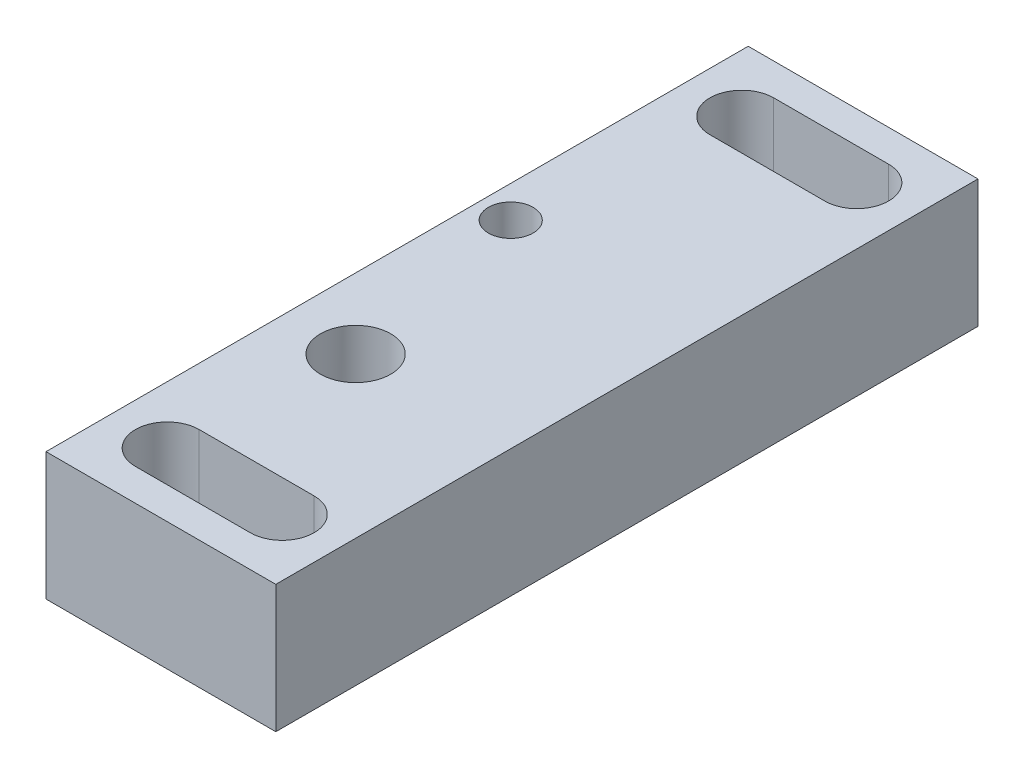
ISO-10303-21;
HEADER;
FILE_DESCRIPTION(('STEP AP214'),'2;1');
FILE_NAME('part.step','',(''),(''),'','','');
FILE_SCHEMA(('AUTOMOTIVE_DESIGN { 1 0 10303 214 1 1 1 1 }'));
ENDSEC;
DATA;
#1=APPLICATION_CONTEXT('core data for automotive mechanical design processes');
#2=APPLICATION_PROTOCOL_DEFINITION('international standard','automotive_design',2000,#1);
#3=PRODUCT_CONTEXT('',#1,'mechanical');
#4=PRODUCT('Part','Part','',(#3));
#5=PRODUCT_RELATED_PRODUCT_CATEGORY('part','',(#4));
#6=PRODUCT_DEFINITION_FORMATION('','',#4);
#7=PRODUCT_DEFINITION_CONTEXT('part definition',#1,'design');
#8=PRODUCT_DEFINITION('design','',#6,#7);
#9=PRODUCT_DEFINITION_SHAPE('','',#8);
#10=(LENGTH_UNIT() NAMED_UNIT(*) SI_UNIT(.MILLI.,.METRE.));
#11=(NAMED_UNIT(*) PLANE_ANGLE_UNIT() SI_UNIT($,.RADIAN.));
#12=(NAMED_UNIT(*) SI_UNIT($,.STERADIAN.) SOLID_ANGLE_UNIT());
#13=UNCERTAINTY_MEASURE_WITH_UNIT(LENGTH_MEASURE(1.E-05),#10,'distance_accuracy_value','');
#14=(GEOMETRIC_REPRESENTATION_CONTEXT(3) GLOBAL_UNCERTAINTY_ASSIGNED_CONTEXT((#13)) GLOBAL_UNIT_ASSIGNED_CONTEXT((#10,
#11,#12)) REPRESENTATION_CONTEXT('',''));
#15=CARTESIAN_POINT('',(0.,0.,0.));
#16=DIRECTION('',(0.,0.,1.));
#17=DIRECTION('',(1.,0.,0.));
#18=AXIS2_PLACEMENT_3D('',#15,#16,#17);
#19=CARTESIAN_POINT('',(0.,10.,0.));
#20=DIRECTION('',(0.,1.,0.));
#21=DIRECTION('',(0.,0.,1.));
#22=AXIS2_PLACEMENT_3D('',#19,#20,#21);
#23=PLANE('',#22);
#24=CARTESIAN_POINT('',(4.5,10.,22.5));
#25=DIRECTION('',(0.,-1.,0.));
#26=DIRECTION('',(0.,0.,1.));
#27=AXIS2_PLACEMENT_3D('',#24,#25,#26);
#28=CIRCLE('',#27,2.5);
#29=CARTESIAN_POINT('',(4.5,10.,25.));
#30=VERTEX_POINT('',#29);
#31=CARTESIAN_POINT('',(4.5,10.,20.));
#32=VERTEX_POINT('',#31);
#33=EDGE_CURVE('E187',#30,#32,#28,.F.);
#34=ORIENTED_EDGE('',*,*,#33,.F.);
#35=DIRECTION('',(-1.,0.,0.));
#36=VECTOR('',#35,1.);
#37=CARTESIAN_POINT('',(0.,10.,25.));
#38=LINE('',#37,#36);
#39=CARTESIAN_POINT('',(-4.5,10.,25.));
#40=VERTEX_POINT('',#39);
#41=EDGE_CURVE('E190',#30,#40,#38,.T.);
#42=ORIENTED_EDGE('',*,*,#41,.T.);
#43=CARTESIAN_POINT('',(-4.5,10.,22.5));
#44=DIRECTION('',(0.,-1.,0.));
#45=DIRECTION('',(0.,0.,1.));
#46=AXIS2_PLACEMENT_3D('',#43,#44,#45);
#47=CIRCLE('',#46,2.5);
#48=CARTESIAN_POINT('',(-4.5,10.,20.));
#49=VERTEX_POINT('',#48);
#50=EDGE_CURVE('E194',#49,#40,#47,.F.);
#51=ORIENTED_EDGE('',*,*,#50,.F.);
#52=DIRECTION('',(1.,0.,0.));
#53=VECTOR('',#52,1.);
#54=CARTESIAN_POINT('',(0.,10.,20.));
#55=LINE('',#54,#53);
#56=EDGE_CURVE('E196',#49,#32,#55,.T.);
#57=ORIENTED_EDGE('',*,*,#56,.T.);
#58=EDGE_LOOP('',(#34,#42,#51,#57));
#59=FACE_BOUND('',#58,.T.);
#60=CARTESIAN_POINT('',(-3.5,10.,8.75000000000001));
#61=DIRECTION('',(0.,-1.,0.));
#62=DIRECTION('',(0.,0.,1.));
#63=AXIS2_PLACEMENT_3D('',#60,#61,#62);
#64=CIRCLE('',#63,2.75);
#65=CARTESIAN_POINT('',(-3.5,10.,11.5));
#66=VERTEX_POINT('',#65);
#67=EDGE_CURVE('E251',#66,#66,#64,.T.);
#68=ORIENTED_EDGE('',*,*,#67,.T.);
#69=EDGE_LOOP('',(#68));
#70=FACE_BOUND('',#69,.T.);
#71=CARTESIAN_POINT('',(-6.5,10.,-6.4));
#72=DIRECTION('',(0.,-1.,0.));
#73=DIRECTION('',(0.,0.,1.));
#74=AXIS2_PLACEMENT_3D('',#71,#72,#73);
#75=CIRCLE('',#74,1.75);
#76=CARTESIAN_POINT('',(-6.5,10.,-4.65));
#77=VERTEX_POINT('',#76);
#78=EDGE_CURVE('E255',#77,#77,#75,.T.);
#79=ORIENTED_EDGE('',*,*,#78,.T.);
#80=EDGE_LOOP('',(#79));
#81=FACE_BOUND('',#80,.T.);
#82=DIRECTION('',(0.,0.,-1.));
#83=VECTOR('',#82,1.);
#84=CARTESIAN_POINT('',(-9.,10.,-27.5));
#85=LINE('',#84,#83);
#86=CARTESIAN_POINT('',(-9.,10.,27.5));
#87=VERTEX_POINT('',#86);
#88=CARTESIAN_POINT('',(-9.,10.,-27.5));
#89=VERTEX_POINT('',#88);
#90=EDGE_CURVE('E258',#87,#89,#85,.T.);
#91=ORIENTED_EDGE('',*,*,#90,.F.);
#92=DIRECTION('',(-1.,0.,0.));
#93=VECTOR('',#92,1.);
#94=CARTESIAN_POINT('',(8.99999999999999,10.,27.5));
#95=LINE('',#94,#93);
#96=CARTESIAN_POINT('',(8.99999999999999,10.,27.5));
#97=VERTEX_POINT('',#96);
#98=EDGE_CURVE('E268',#97,#87,#95,.T.);
#99=ORIENTED_EDGE('',*,*,#98,.F.);
#100=DIRECTION('',(0.,0.,1.));
#101=VECTOR('',#100,1.);
#102=CARTESIAN_POINT('',(9.,10.,-27.5));
#103=LINE('',#102,#101);
#104=CARTESIAN_POINT('',(9.,10.,-27.5));
#105=VERTEX_POINT('',#104);
#106=EDGE_CURVE('E265',#105,#97,#103,.T.);
#107=ORIENTED_EDGE('',*,*,#106,.F.);
#108=DIRECTION('',(1.,0.,0.));
#109=VECTOR('',#108,1.);
#110=CARTESIAN_POINT('',(9.,10.,-27.5));
#111=LINE('',#110,#109);
#112=EDGE_CURVE('E261',#89,#105,#111,.T.);
#113=ORIENTED_EDGE('',*,*,#112,.F.);
#114=EDGE_LOOP('',(#91,#99,#107,#113));
#115=FACE_BOUND('',#114,.T.);
#116=DIRECTION('',(1.,0.,0.));
#117=VECTOR('',#116,1.);
#118=CARTESIAN_POINT('',(0.,10.,-20.));
#119=LINE('',#118,#117);
#120=CARTESIAN_POINT('',(-4.5,10.,-20.));
#121=VERTEX_POINT('',#120);
#122=CARTESIAN_POINT('',(4.5,10.,-20.));
#123=VERTEX_POINT('',#122);
#124=EDGE_CURVE('E165',#121,#123,#119,.T.);
#125=ORIENTED_EDGE('',*,*,#124,.F.);
#126=CARTESIAN_POINT('',(-4.5,10.,-22.5));
#127=DIRECTION('',(0.,-1.,0.));
#128=DIRECTION('',(0.,0.,1.));
#129=AXIS2_PLACEMENT_3D('',#126,#127,#128);
#130=CIRCLE('',#129,2.5);
#131=CARTESIAN_POINT('',(-4.5,10.,-25.));
#132=VERTEX_POINT('',#131);
#133=EDGE_CURVE('E170',#121,#132,#130,.T.);
#134=ORIENTED_EDGE('',*,*,#133,.T.);
#135=DIRECTION('',(-1.,0.,0.));
#136=VECTOR('',#135,1.);
#137=CARTESIAN_POINT('',(0.,10.,-25.));
#138=LINE('',#137,#136);
#139=CARTESIAN_POINT('',(4.5,10.,-25.));
#140=VERTEX_POINT('',#139);
#141=EDGE_CURVE('E166',#140,#132,#138,.T.);
#142=ORIENTED_EDGE('',*,*,#141,.F.);
#143=CARTESIAN_POINT('',(4.5,10.,-22.5));
#144=DIRECTION('',(0.,-1.,0.));
#145=DIRECTION('',(0.,0.,1.));
#146=AXIS2_PLACEMENT_3D('',#143,#144,#145);
#147=CIRCLE('',#146,2.5);
#148=EDGE_CURVE('E151',#140,#123,#147,.T.);
#149=ORIENTED_EDGE('',*,*,#148,.T.);
#150=EDGE_LOOP('',(#125,#134,#142,#149));
#151=FACE_BOUND('',#150,.T.);
#152=ADVANCED_FACE('F33',(#59,#70,#81,#115,#151),#23,.T.);
#153=CARTESIAN_POINT('',(0.,0.,0.));
#154=DIRECTION('',(0.,1.,0.));
#155=DIRECTION('',(0.,0.,1.));
#156=AXIS2_PLACEMENT_3D('',#153,#154,#155);
#157=PLANE('',#156);
#158=CARTESIAN_POINT('',(-6.5,0.,-6.4));
#159=DIRECTION('',(0.,1.,0.));
#160=DIRECTION('',(0.,0.,-1.));
#161=AXIS2_PLACEMENT_3D('',#158,#159,#160);
#162=CIRCLE('',#161,3.);
#163=CARTESIAN_POINT('',(-6.5,0.,-3.4));
#164=VERTEX_POINT('',#163);
#165=CARTESIAN_POINT('',(-6.5,0.,-9.4));
#166=VERTEX_POINT('',#165);
#167=EDGE_CURVE('E159',#164,#166,#162,.T.);
#168=ORIENTED_EDGE('',*,*,#167,.T.);
#169=DIRECTION('',(-1.,0.,0.));
#170=VECTOR('',#169,1.);
#171=CARTESIAN_POINT('',(0.,0.,-9.39999999999999));
#172=LINE('',#171,#170);
#173=CARTESIAN_POINT('',(-9.,0.,-9.4));
#174=VERTEX_POINT('',#173);
#175=EDGE_CURVE('E233',#166,#174,#172,.T.);
#176=ORIENTED_EDGE('',*,*,#175,.T.);
#177=DIRECTION('',(0.,0.,-1.));
#178=VECTOR('',#177,1.);
#179=CARTESIAN_POINT('',(-9.,0.,-27.5));
#180=LINE('',#179,#178);
#181=CARTESIAN_POINT('',(-9.,0.,-27.5));
#182=VERTEX_POINT('',#181);
#183=EDGE_CURVE('E254',#174,#182,#180,.T.);
#184=ORIENTED_EDGE('',*,*,#183,.T.);
#185=DIRECTION('',(1.,0.,0.));
#186=VECTOR('',#185,1.);
#187=CARTESIAN_POINT('',(9.,0.,-27.5));
#188=LINE('',#187,#186);
#189=CARTESIAN_POINT('',(9.,0.,-27.5));
#190=VERTEX_POINT('',#189);
#191=EDGE_CURVE('E275',#182,#190,#188,.T.);
#192=ORIENTED_EDGE('',*,*,#191,.T.);
#193=DIRECTION('',(0.,0.,1.));
#194=VECTOR('',#193,1.);
#195=CARTESIAN_POINT('',(9.,0.,-27.5));
#196=LINE('',#195,#194);
#197=CARTESIAN_POINT('',(8.99999999999999,0.,27.5));
#198=VERTEX_POINT('',#197);
#199=EDGE_CURVE('E278',#190,#198,#196,.T.);
#200=ORIENTED_EDGE('',*,*,#199,.T.);
#201=DIRECTION('',(-1.,0.,0.));
#202=VECTOR('',#201,1.);
#203=CARTESIAN_POINT('',(8.99999999999999,0.,27.5));
#204=LINE('',#203,#202);
#205=CARTESIAN_POINT('',(-9.,0.,27.5));
#206=VERTEX_POINT('',#205);
#207=EDGE_CURVE('E262',#198,#206,#204,.T.);
#208=ORIENTED_EDGE('',*,*,#207,.T.);
#209=CARTESIAN_POINT('',(-9.,0.,-3.4));
#210=VERTEX_POINT('',#209);
#211=EDGE_CURVE('E272',#206,#210,#180,.T.);
#212=ORIENTED_EDGE('',*,*,#211,.T.);
#213=DIRECTION('',(1.,0.,0.));
#214=VECTOR('',#213,1.);
#215=CARTESIAN_POINT('',(0.,0.,-3.4));
#216=LINE('',#215,#214);
#217=EDGE_CURVE('E220',#210,#164,#216,.T.);
#218=ORIENTED_EDGE('',*,*,#217,.T.);
#219=EDGE_LOOP('',(#168,#176,#184,#192,#200,#208,#212,#218));
#220=FACE_BOUND('',#219,.T.);
#221=CARTESIAN_POINT('',(-3.5,0.,8.75000000000001));
#222=DIRECTION('',(0.,1.,0.));
#223=DIRECTION('',(0.,0.,-1.));
#224=AXIS2_PLACEMENT_3D('',#221,#222,#223);
#225=CIRCLE('',#224,4.75);
#226=CARTESIAN_POINT('',(-3.5,0.,4.00000000000001));
#227=VERTEX_POINT('',#226);
#228=EDGE_CURVE('E240',#227,#227,#225,.T.);
#229=ORIENTED_EDGE('',*,*,#228,.T.);
#230=EDGE_LOOP('',(#229));
#231=FACE_BOUND('',#230,.T.);
#232=DIRECTION('',(1.,0.,0.));
#233=VECTOR('',#232,1.);
#234=CARTESIAN_POINT('',(0.,0.,20.));
#235=LINE('',#234,#233);
#236=CARTESIAN_POINT('',(-4.5,0.,20.));
#237=VERTEX_POINT('',#236);
#238=CARTESIAN_POINT('',(4.5,0.,20.));
#239=VERTEX_POINT('',#238);
#240=EDGE_CURVE('E191',#237,#239,#235,.T.);
#241=ORIENTED_EDGE('',*,*,#240,.F.);
#242=CARTESIAN_POINT('',(-4.5,0.,22.5));
#243=DIRECTION('',(0.,-1.,0.));
#244=DIRECTION('',(0.,0.,1.));
#245=AXIS2_PLACEMENT_3D('',#242,#243,#244);
#246=CIRCLE('',#245,2.5);
#247=CARTESIAN_POINT('',(-4.5,0.,25.));
#248=VERTEX_POINT('',#247);
#249=EDGE_CURVE('E206',#237,#248,#246,.F.);
#250=ORIENTED_EDGE('',*,*,#249,.T.);
#251=DIRECTION('',(-1.,0.,0.));
#252=VECTOR('',#251,1.);
#253=CARTESIAN_POINT('',(0.,0.,25.));
#254=LINE('',#253,#252);
#255=CARTESIAN_POINT('',(4.5,0.,25.));
#256=VERTEX_POINT('',#255);
#257=EDGE_CURVE('E203',#256,#248,#254,.T.);
#258=ORIENTED_EDGE('',*,*,#257,.F.);
#259=CARTESIAN_POINT('',(4.5,0.,22.5));
#260=DIRECTION('',(0.,-1.,0.));
#261=DIRECTION('',(0.,0.,1.));
#262=AXIS2_PLACEMENT_3D('',#259,#260,#261);
#263=CIRCLE('',#262,2.5);
#264=EDGE_CURVE('E200',#256,#239,#263,.F.);
#265=ORIENTED_EDGE('',*,*,#264,.T.);
#266=EDGE_LOOP('',(#241,#250,#258,#265));
#267=FACE_BOUND('',#266,.T.);
#268=CARTESIAN_POINT('',(4.5,0.,-22.5));
#269=DIRECTION('',(0.,-1.,0.));
#270=DIRECTION('',(0.,0.,1.));
#271=AXIS2_PLACEMENT_3D('',#268,#269,#270);
#272=CIRCLE('',#271,2.5);
#273=CARTESIAN_POINT('',(4.5,0.,-25.));
#274=VERTEX_POINT('',#273);
#275=CARTESIAN_POINT('',(4.5,0.,-20.));
#276=VERTEX_POINT('',#275);
#277=EDGE_CURVE('E154',#274,#276,#272,.T.);
#278=ORIENTED_EDGE('',*,*,#277,.F.);
#279=DIRECTION('',(-1.,0.,0.));
#280=VECTOR('',#279,1.);
#281=CARTESIAN_POINT('',(0.,0.,-25.));
#282=LINE('',#281,#280);
#283=CARTESIAN_POINT('',(-4.5,0.,-25.));
#284=VERTEX_POINT('',#283);
#285=EDGE_CURVE('E167',#274,#284,#282,.T.);
#286=ORIENTED_EDGE('',*,*,#285,.T.);
#287=CARTESIAN_POINT('',(-4.5,0.,-22.5));
#288=DIRECTION('',(0.,-1.,0.));
#289=DIRECTION('',(0.,0.,1.));
#290=AXIS2_PLACEMENT_3D('',#287,#288,#289);
#291=CIRCLE('',#290,2.5);
#292=CARTESIAN_POINT('',(-4.5,0.,-20.));
#293=VERTEX_POINT('',#292);
#294=EDGE_CURVE('E180',#293,#284,#291,.T.);
#295=ORIENTED_EDGE('',*,*,#294,.F.);
#296=DIRECTION('',(1.,0.,0.));
#297=VECTOR('',#296,1.);
#298=CARTESIAN_POINT('',(0.,0.,-20.));
#299=LINE('',#298,#297);
#300=EDGE_CURVE('E177',#293,#276,#299,.T.);
#301=ORIENTED_EDGE('',*,*,#300,.T.);
#302=EDGE_LOOP('',(#278,#286,#295,#301));
#303=FACE_BOUND('',#302,.T.);
#304=ADVANCED_FACE('F297',(#220,#231,#267,#303),#157,.F.);
#305=CARTESIAN_POINT('',(-6.5,0.,-6.4));
#306=DIRECTION('',(0.,1.,0.));
#307=DIRECTION('',(0.,0.,1.));
#308=AXIS2_PLACEMENT_3D('',#305,#306,#307);
#309=CYLINDRICAL_SURFACE('',#308,1.75);
#310=ORIENTED_EDGE('',*,*,#78,.F.);
#311=EDGE_LOOP('',(#310));
#312=FACE_BOUND('',#311,.T.);
#313=CARTESIAN_POINT('',(-6.5,4.,-6.4));
#314=DIRECTION('',(0.,1.,0.));
#315=DIRECTION('',(0.,0.,-1.));
#316=AXIS2_PLACEMENT_3D('',#313,#314,#315);
#317=CIRCLE('',#316,1.75);
#318=CARTESIAN_POINT('',(-6.5,4.,-8.14999999999999));
#319=VERTEX_POINT('',#318);
#320=EDGE_CURVE('E216',#319,#319,#317,.F.);
#321=ORIENTED_EDGE('',*,*,#320,.T.);
#322=EDGE_LOOP('',(#321));
#323=FACE_BOUND('',#322,.T.);
#324=ADVANCED_FACE('F344',(#312,#323),#309,.F.);
#325=CARTESIAN_POINT('',(-3.5,0.,8.75000000000001));
#326=DIRECTION('',(0.,1.,0.));
#327=DIRECTION('',(0.,0.,1.));
#328=AXIS2_PLACEMENT_3D('',#325,#326,#327);
#329=CYLINDRICAL_SURFACE('',#328,2.75);
#330=ORIENTED_EDGE('',*,*,#67,.F.);
#331=EDGE_LOOP('',(#330));
#332=FACE_BOUND('',#331,.T.);
#333=CARTESIAN_POINT('',(-3.5,5.5,8.75000000000001));
#334=DIRECTION('',(0.,1.,0.));
#335=DIRECTION('',(0.,0.,-1.));
#336=AXIS2_PLACEMENT_3D('',#333,#334,#335);
#337=CIRCLE('',#336,2.75);
#338=CARTESIAN_POINT('',(-3.5,5.5,6.00000000000001));
#339=VERTEX_POINT('',#338);
#340=EDGE_CURVE('E37',#339,#339,#337,.F.);
#341=ORIENTED_EDGE('',*,*,#340,.T.);
#342=EDGE_LOOP('',(#341));
#343=FACE_BOUND('',#342,.T.);
#344=ADVANCED_FACE('F359',(#332,#343),#329,.F.);
#345=CARTESIAN_POINT('',(-9.,10.,-27.5));
#346=DIRECTION('',(1.,0.,0.));
#347=DIRECTION('',(0.,0.,1.));
#348=AXIS2_PLACEMENT_3D('',#345,#346,#347);
#349=PLANE('',#348);
#350=ORIENTED_EDGE('',*,*,#211,.F.);
#351=DIRECTION('',(0.,-1.,0.));
#352=VECTOR('',#351,1.);
#353=CARTESIAN_POINT('',(-9.,10.,27.5));
#354=LINE('',#353,#352);
#355=EDGE_CURVE('E271',#87,#206,#354,.T.);
#356=ORIENTED_EDGE('',*,*,#355,.F.);
#357=ORIENTED_EDGE('',*,*,#90,.T.);
#358=DIRECTION('',(0.,-1.,0.));
#359=VECTOR('',#358,1.);
#360=CARTESIAN_POINT('',(-9.,10.,-27.5));
#361=LINE('',#360,#359);
#362=EDGE_CURVE('E11',#89,#182,#361,.T.);
#363=ORIENTED_EDGE('',*,*,#362,.T.);
#364=ORIENTED_EDGE('',*,*,#183,.F.);
#365=DIRECTION('',(0.,-1.,0.));
#366=VECTOR('',#365,1.);
#367=CARTESIAN_POINT('',(-9.,4.,-9.4));
#368=LINE('',#367,#366);
#369=CARTESIAN_POINT('',(-9.,4.,-9.4));
#370=VERTEX_POINT('',#369);
#371=EDGE_CURVE('E243',#370,#174,#368,.T.);
#372=ORIENTED_EDGE('',*,*,#371,.F.);
#373=DIRECTION('',(0.,0.,1.));
#374=VECTOR('',#373,1.);
#375=CARTESIAN_POINT('',(-9.,4.,0.));
#376=LINE('',#375,#374);
#377=CARTESIAN_POINT('',(-9.,4.,-3.4));
#378=VERTEX_POINT('',#377);
#379=EDGE_CURVE('E225',#370,#378,#376,.T.);
#380=ORIENTED_EDGE('',*,*,#379,.T.);
#381=DIRECTION('',(0.,-1.,0.));
#382=VECTOR('',#381,1.);
#383=CARTESIAN_POINT('',(-9.,4.,-3.4));
#384=LINE('',#383,#382);
#385=EDGE_CURVE('E241',#378,#210,#384,.T.);
#386=ORIENTED_EDGE('',*,*,#385,.T.);
#387=EDGE_LOOP('',(#350,#356,#357,#363,#364,#372,#380,#386));
#388=FACE_BOUND('',#387,.T.);
#389=ADVANCED_FACE('F35',(#388),#349,.F.);
#390=CARTESIAN_POINT('',(9.,10.,-27.5));
#391=DIRECTION('',(0.,0.,1.));
#392=DIRECTION('',(-1.,0.,0.));
#393=AXIS2_PLACEMENT_3D('',#390,#391,#392);
#394=PLANE('',#393);
#395=ORIENTED_EDGE('',*,*,#191,.F.);
#396=ORIENTED_EDGE('',*,*,#362,.F.);
#397=ORIENTED_EDGE('',*,*,#112,.T.);
#398=DIRECTION('',(0.,-1.,0.));
#399=VECTOR('',#398,1.);
#400=CARTESIAN_POINT('',(9.,10.,-27.5));
#401=LINE('',#400,#399);
#402=EDGE_CURVE('E42',#105,#190,#401,.T.);
#403=ORIENTED_EDGE('',*,*,#402,.T.);
#404=EDGE_LOOP('',(#395,#396,#397,#403));
#405=FACE_BOUND('',#404,.T.);
#406=ADVANCED_FACE('F289',(#405),#394,.F.);
#407=CARTESIAN_POINT('',(9.,10.,-27.5));
#408=DIRECTION('',(-1.,0.,0.));
#409=DIRECTION('',(0.,0.,-1.));
#410=AXIS2_PLACEMENT_3D('',#407,#408,#409);
#411=PLANE('',#410);
#412=ORIENTED_EDGE('',*,*,#199,.F.);
#413=ORIENTED_EDGE('',*,*,#402,.F.);
#414=ORIENTED_EDGE('',*,*,#106,.T.);
#415=DIRECTION('',(0.,-1.,0.));
#416=VECTOR('',#415,1.);
#417=CARTESIAN_POINT('',(8.99999999999999,10.,27.5));
#418=LINE('',#417,#416);
#419=EDGE_CURVE('E284',#97,#198,#418,.T.);
#420=ORIENTED_EDGE('',*,*,#419,.T.);
#421=EDGE_LOOP('',(#412,#413,#414,#420));
#422=FACE_BOUND('',#421,.T.);
#423=ADVANCED_FACE('F294',(#422),#411,.F.);
#424=CARTESIAN_POINT('',(8.99999999999999,10.,27.5));
#425=DIRECTION('',(0.,0.,-1.));
#426=DIRECTION('',(1.,0.,0.));
#427=AXIS2_PLACEMENT_3D('',#424,#425,#426);
#428=PLANE('',#427);
#429=ORIENTED_EDGE('',*,*,#207,.F.);
#430=ORIENTED_EDGE('',*,*,#419,.F.);
#431=ORIENTED_EDGE('',*,*,#98,.T.);
#432=ORIENTED_EDGE('',*,*,#355,.T.);
#433=EDGE_LOOP('',(#429,#430,#431,#432));
#434=FACE_BOUND('',#433,.T.);
#435=ADVANCED_FACE('F308',(#434),#428,.F.);
#436=CARTESIAN_POINT('',(-3.5,5.5,8.75000000000001));
#437=DIRECTION('',(0.,-1.,0.));
#438=DIRECTION('',(0.,0.,-1.));
#439=AXIS2_PLACEMENT_3D('',#436,#437,#438);
#440=PLANE('',#439);
#441=CARTESIAN_POINT('',(-3.5,5.5,8.75000000000001));
#442=DIRECTION('',(0.,1.,0.));
#443=DIRECTION('',(0.,0.,-1.));
#444=AXIS2_PLACEMENT_3D('',#441,#442,#443);
#445=CIRCLE('',#444,4.75);
#446=CARTESIAN_POINT('',(-3.5,5.5,4.00000000000001));
#447=VERTEX_POINT('',#446);
#448=EDGE_CURVE('E246',#447,#447,#445,.T.);
#449=ORIENTED_EDGE('',*,*,#448,.F.);
#450=EDGE_LOOP('',(#449));
#451=FACE_BOUND('',#450,.T.);
#452=ORIENTED_EDGE('',*,*,#340,.F.);
#453=EDGE_LOOP('',(#452));
#454=FACE_BOUND('',#453,.T.);
#455=ADVANCED_FACE('F353',(#451,#454),#440,.T.);
#456=CARTESIAN_POINT('',(-3.5,5.5,8.75000000000001));
#457=DIRECTION('',(0.,-1.,0.));
#458=DIRECTION('',(0.,0.,-1.));
#459=AXIS2_PLACEMENT_3D('',#456,#457,#458);
#460=CYLINDRICAL_SURFACE('',#459,4.75);
#461=ORIENTED_EDGE('',*,*,#448,.T.);
#462=EDGE_LOOP('',(#461));
#463=FACE_BOUND('',#462,.T.);
#464=ORIENTED_EDGE('',*,*,#228,.F.);
#465=EDGE_LOOP('',(#464));
#466=FACE_BOUND('',#465,.T.);
#467=ADVANCED_FACE('F371',(#463,#466),#460,.F.);
#468=CARTESIAN_POINT('',(-6.5,4.,-6.4));
#469=DIRECTION('',(0.,-1.,0.));
#470=DIRECTION('',(0.,0.,-1.));
#471=AXIS2_PLACEMENT_3D('',#468,#469,#470);
#472=CYLINDRICAL_SURFACE('',#471,3.);
#473=ORIENTED_EDGE('',*,*,#167,.F.);
#474=DIRECTION('',(0.,-1.,0.));
#475=VECTOR('',#474,1.);
#476=CARTESIAN_POINT('',(-6.5,4.,-3.4));
#477=LINE('',#476,#475);
#478=CARTESIAN_POINT('',(-6.5,4.,-3.4));
#479=VERTEX_POINT('',#478);
#480=EDGE_CURVE('E238',#479,#164,#477,.T.);
#481=ORIENTED_EDGE('',*,*,#480,.F.);
#482=CARTESIAN_POINT('',(-6.5,4.,-6.4));
#483=DIRECTION('',(0.,1.,0.));
#484=DIRECTION('',(0.,0.,-1.));
#485=AXIS2_PLACEMENT_3D('',#482,#483,#484);
#486=CIRCLE('',#485,3.);
#487=CARTESIAN_POINT('',(-6.5,4.,-9.4));
#488=VERTEX_POINT('',#487);
#489=EDGE_CURVE('E219',#479,#488,#486,.T.);
#490=ORIENTED_EDGE('',*,*,#489,.T.);
#491=DIRECTION('',(0.,-1.,0.));
#492=VECTOR('',#491,1.);
#493=CARTESIAN_POINT('',(-6.5,4.,-9.4));
#494=LINE('',#493,#492);
#495=EDGE_CURVE('E230',#488,#166,#494,.T.);
#496=ORIENTED_EDGE('',*,*,#495,.T.);
#497=EDGE_LOOP('',(#473,#481,#490,#496));
#498=FACE_BOUND('',#497,.T.);
#499=ADVANCED_FACE('F318',(#498),#472,.F.);
#500=CARTESIAN_POINT('',(0.,4.,-3.4));
#501=DIRECTION('',(0.,0.,1.));
#502=DIRECTION('',(-1.,0.,0.));
#503=AXIS2_PLACEMENT_3D('',#500,#501,#502);
#504=PLANE('',#503);
#505=ORIENTED_EDGE('',*,*,#217,.F.);
#506=ORIENTED_EDGE('',*,*,#385,.F.);
#507=DIRECTION('',(1.,0.,0.));
#508=VECTOR('',#507,1.);
#509=CARTESIAN_POINT('',(0.,4.,-3.4));
#510=LINE('',#509,#508);
#511=EDGE_CURVE('E228',#378,#479,#510,.T.);
#512=ORIENTED_EDGE('',*,*,#511,.T.);
#513=ORIENTED_EDGE('',*,*,#480,.T.);
#514=EDGE_LOOP('',(#505,#506,#512,#513));
#515=FACE_BOUND('',#514,.T.);
#516=ADVANCED_FACE('F314',(#515),#504,.F.);
#517=CARTESIAN_POINT('',(0.,4.,-9.39999999999999));
#518=DIRECTION('',(0.,0.,-1.));
#519=DIRECTION('',(1.,0.,0.));
#520=AXIS2_PLACEMENT_3D('',#517,#518,#519);
#521=PLANE('',#520);
#522=ORIENTED_EDGE('',*,*,#175,.F.);
#523=ORIENTED_EDGE('',*,*,#495,.F.);
#524=DIRECTION('',(-1.,0.,0.));
#525=VECTOR('',#524,1.);
#526=CARTESIAN_POINT('',(0.,4.,-9.39999999999999));
#527=LINE('',#526,#525);
#528=EDGE_CURVE('E223',#488,#370,#527,.T.);
#529=ORIENTED_EDGE('',*,*,#528,.T.);
#530=ORIENTED_EDGE('',*,*,#371,.T.);
#531=EDGE_LOOP('',(#522,#523,#529,#530));
#532=FACE_BOUND('',#531,.T.);
#533=ADVANCED_FACE('F321',(#532),#521,.F.);
#534=CARTESIAN_POINT('',(0.,4.,0.));
#535=DIRECTION('',(0.,-1.,0.));
#536=DIRECTION('',(0.,0.,-1.));
#537=AXIS2_PLACEMENT_3D('',#534,#535,#536);
#538=PLANE('',#537);
#539=ORIENTED_EDGE('',*,*,#320,.F.);
#540=EDGE_LOOP('',(#539));
#541=FACE_BOUND('',#540,.T.);
#542=ORIENTED_EDGE('',*,*,#489,.F.);
#543=ORIENTED_EDGE('',*,*,#511,.F.);
#544=ORIENTED_EDGE('',*,*,#379,.F.);
#545=ORIENTED_EDGE('',*,*,#528,.F.);
#546=EDGE_LOOP('',(#542,#543,#544,#545));
#547=FACE_BOUND('',#546,.T.);
#548=ADVANCED_FACE('F323',(#541,#547),#538,.T.);
#549=CARTESIAN_POINT('',(4.5,10.,22.5));
#550=DIRECTION('',(0.,-1.,0.));
#551=DIRECTION('',(0.,0.,-1.));
#552=AXIS2_PLACEMENT_3D('',#549,#550,#551);
#553=CYLINDRICAL_SURFACE('',#552,2.5);
#554=ORIENTED_EDGE('',*,*,#264,.F.);
#555=DIRECTION('',(0.,-1.,0.));
#556=VECTOR('',#555,1.);
#557=CARTESIAN_POINT('',(4.5,10.,25.));
#558=LINE('',#557,#556);
#559=EDGE_CURVE('E178',#30,#256,#558,.T.);
#560=ORIENTED_EDGE('',*,*,#559,.F.);
#561=ORIENTED_EDGE('',*,*,#33,.T.);
#562=DIRECTION('',(0.,-1.,0.));
#563=VECTOR('',#562,1.);
#564=CARTESIAN_POINT('',(4.5,10.,20.));
#565=LINE('',#564,#563);
#566=EDGE_CURVE('E199',#32,#239,#565,.T.);
#567=ORIENTED_EDGE('',*,*,#566,.T.);
#568=EDGE_LOOP('',(#554,#560,#561,#567));
#569=FACE_BOUND('',#568,.T.);
#570=ADVANCED_FACE('F325',(#569),#553,.F.);
#571=CARTESIAN_POINT('',(0.,10.,25.));
#572=DIRECTION('',(0.,0.,-1.));
#573=DIRECTION('',(1.,0.,0.));
#574=AXIS2_PLACEMENT_3D('',#571,#572,#573);
#575=PLANE('',#574);
#576=ORIENTED_EDGE('',*,*,#257,.T.);
#577=DIRECTION('',(0.,-1.,0.));
#578=VECTOR('',#577,1.);
#579=CARTESIAN_POINT('',(-4.5,10.,25.));
#580=LINE('',#579,#578);
#581=EDGE_CURVE('E213',#40,#248,#580,.T.);
#582=ORIENTED_EDGE('',*,*,#581,.F.);
#583=ORIENTED_EDGE('',*,*,#41,.F.);
#584=ORIENTED_EDGE('',*,*,#559,.T.);
#585=EDGE_LOOP('',(#576,#582,#583,#584));
#586=FACE_BOUND('',#585,.T.);
#587=ADVANCED_FACE('F332',(#586),#575,.T.);
#588=CARTESIAN_POINT('',(-4.5,10.,22.5));
#589=DIRECTION('',(0.,-1.,0.));
#590=DIRECTION('',(0.,0.,-1.));
#591=AXIS2_PLACEMENT_3D('',#588,#589,#590);
#592=CYLINDRICAL_SURFACE('',#591,2.5);
#593=ORIENTED_EDGE('',*,*,#249,.F.);
#594=DIRECTION('',(0.,-1.,0.));
#595=VECTOR('',#594,1.);
#596=CARTESIAN_POINT('',(-4.5,10.,20.));
#597=LINE('',#596,#595);
#598=EDGE_CURVE('E57',#49,#237,#597,.T.);
#599=ORIENTED_EDGE('',*,*,#598,.F.);
#600=ORIENTED_EDGE('',*,*,#50,.T.);
#601=ORIENTED_EDGE('',*,*,#581,.T.);
#602=EDGE_LOOP('',(#593,#599,#600,#601));
#603=FACE_BOUND('',#602,.T.);
#604=ADVANCED_FACE('F409',(#603),#592,.F.);
#605=CARTESIAN_POINT('',(0.,10.,20.));
#606=DIRECTION('',(0.,0.,1.));
#607=DIRECTION('',(-1.,0.,0.));
#608=AXIS2_PLACEMENT_3D('',#605,#606,#607);
#609=PLANE('',#608);
#610=ORIENTED_EDGE('',*,*,#240,.T.);
#611=ORIENTED_EDGE('',*,*,#566,.F.);
#612=ORIENTED_EDGE('',*,*,#56,.F.);
#613=ORIENTED_EDGE('',*,*,#598,.T.);
#614=EDGE_LOOP('',(#610,#611,#612,#613));
#615=FACE_BOUND('',#614,.T.);
#616=ADVANCED_FACE('F419',(#615),#609,.T.);
#617=CARTESIAN_POINT('',(4.5,10.,-22.5));
#618=DIRECTION('',(0.,-1.,0.));
#619=DIRECTION('',(0.,0.,-1.));
#620=AXIS2_PLACEMENT_3D('',#617,#618,#619);
#621=CYLINDRICAL_SURFACE('',#620,2.5);
#622=ORIENTED_EDGE('',*,*,#277,.T.);
#623=DIRECTION('',(0.,-1.,0.));
#624=VECTOR('',#623,1.);
#625=CARTESIAN_POINT('',(4.5,10.,-20.));
#626=LINE('',#625,#624);
#627=EDGE_CURVE('E148',#123,#276,#626,.T.);
#628=ORIENTED_EDGE('',*,*,#627,.F.);
#629=ORIENTED_EDGE('',*,*,#148,.F.);
#630=DIRECTION('',(0.,-1.,0.));
#631=VECTOR('',#630,1.);
#632=CARTESIAN_POINT('',(4.5,10.,-25.));
#633=LINE('',#632,#631);
#634=EDGE_CURVE('E175',#140,#274,#633,.T.);
#635=ORIENTED_EDGE('',*,*,#634,.T.);
#636=EDGE_LOOP('',(#622,#628,#629,#635));
#637=FACE_BOUND('',#636,.T.);
#638=ADVANCED_FACE('F150',(#637),#621,.F.);
#639=CARTESIAN_POINT('',(0.,10.,-20.));
#640=DIRECTION('',(0.,0.,1.));
#641=DIRECTION('',(-1.,0.,0.));
#642=AXIS2_PLACEMENT_3D('',#639,#640,#641);
#643=PLANE('',#642);
#644=ORIENTED_EDGE('',*,*,#300,.F.);
#645=DIRECTION('',(0.,-1.,0.));
#646=VECTOR('',#645,1.);
#647=CARTESIAN_POINT('',(-4.5,10.,-20.));
#648=LINE('',#647,#646);
#649=EDGE_CURVE('E160',#121,#293,#648,.T.);
#650=ORIENTED_EDGE('',*,*,#649,.F.);
#651=ORIENTED_EDGE('',*,*,#124,.T.);
#652=ORIENTED_EDGE('',*,*,#627,.T.);
#653=EDGE_LOOP('',(#644,#650,#651,#652));
#654=FACE_BOUND('',#653,.T.);
#655=ADVANCED_FACE('F169',(#654),#643,.F.);
#656=CARTESIAN_POINT('',(-4.5,10.,-22.5));
#657=DIRECTION('',(0.,-1.,0.));
#658=DIRECTION('',(0.,0.,-1.));
#659=AXIS2_PLACEMENT_3D('',#656,#657,#658);
#660=CYLINDRICAL_SURFACE('',#659,2.5);
#661=ORIENTED_EDGE('',*,*,#294,.T.);
#662=DIRECTION('',(0.,-1.,0.));
#663=VECTOR('',#662,1.);
#664=CARTESIAN_POINT('',(-4.5,10.,-25.));
#665=LINE('',#664,#663);
#666=EDGE_CURVE('E49',#132,#284,#665,.T.);
#667=ORIENTED_EDGE('',*,*,#666,.F.);
#668=ORIENTED_EDGE('',*,*,#133,.F.);
#669=ORIENTED_EDGE('',*,*,#649,.T.);
#670=EDGE_LOOP('',(#661,#667,#668,#669));
#671=FACE_BOUND('',#670,.T.);
#672=ADVANCED_FACE('F445',(#671),#660,.F.);
#673=CARTESIAN_POINT('',(0.,10.,-25.));
#674=DIRECTION('',(0.,0.,-1.));
#675=DIRECTION('',(1.,0.,0.));
#676=AXIS2_PLACEMENT_3D('',#673,#674,#675);
#677=PLANE('',#676);
#678=ORIENTED_EDGE('',*,*,#285,.F.);
#679=ORIENTED_EDGE('',*,*,#634,.F.);
#680=ORIENTED_EDGE('',*,*,#141,.T.);
#681=ORIENTED_EDGE('',*,*,#666,.T.);
#682=EDGE_LOOP('',(#678,#679,#680,#681));
#683=FACE_BOUND('',#682,.T.);
#684=ADVANCED_FACE('F454',(#683),#677,.F.);
#685=CLOSED_SHELL('',(#152,#304,#324,#344,#389,#406,#423,#435,#455,#467,#499,#516,#533,#548,
#570,#587,#604,#616,#638,#655,#672,#684));
#686=MANIFOLD_SOLID_BREP('B2',#685);
#687=ADVANCED_BREP_SHAPE_REPRESENTATION('',(#18,#686),#14);
#688=SHAPE_DEFINITION_REPRESENTATION(#9,#687);
ENDSEC;
END-ISO-10303-21;
